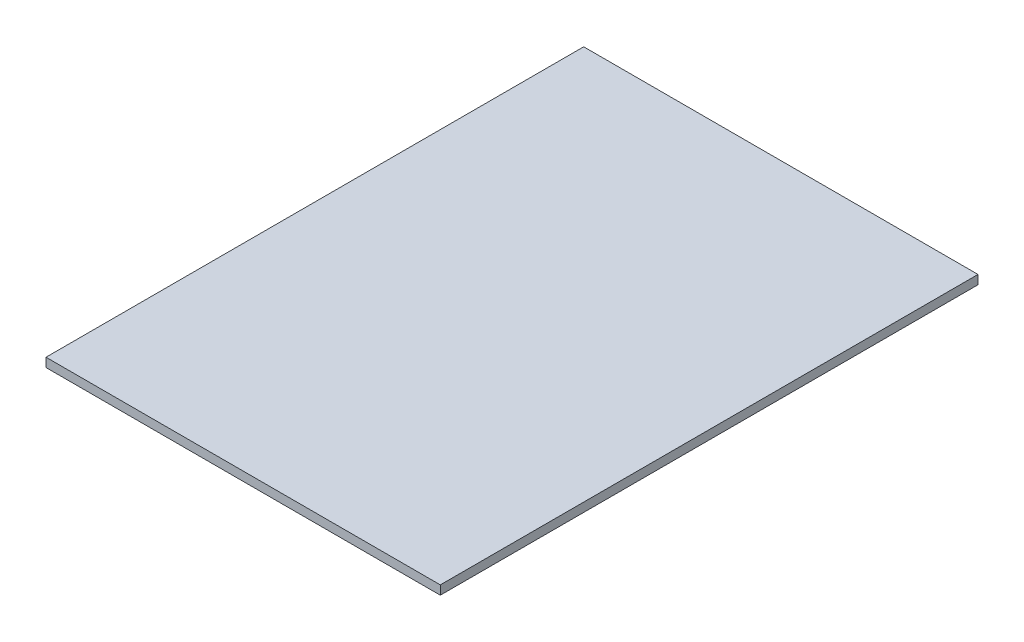
ISO-10303-21;
HEADER;
FILE_DESCRIPTION(('STEP AP214'),'2;1');
FILE_NAME('part.step','',(''),(''),'','','');
FILE_SCHEMA(('AUTOMOTIVE_DESIGN { 1 0 10303 214 1 1 1 1 }'));
ENDSEC;
DATA;
#1=APPLICATION_CONTEXT('core data for automotive mechanical design processes');
#2=APPLICATION_PROTOCOL_DEFINITION('international standard','automotive_design',2000,#1);
#3=PRODUCT_CONTEXT('',#1,'mechanical');
#4=PRODUCT('Part','Part','',(#3));
#5=PRODUCT_RELATED_PRODUCT_CATEGORY('part','',(#4));
#6=PRODUCT_DEFINITION_FORMATION('','',#4);
#7=PRODUCT_DEFINITION_CONTEXT('part definition',#1,'design');
#8=PRODUCT_DEFINITION('design','',#6,#7);
#9=PRODUCT_DEFINITION_SHAPE('','',#8);
#10=(LENGTH_UNIT() NAMED_UNIT(*) SI_UNIT(.MILLI.,.METRE.));
#11=(NAMED_UNIT(*) PLANE_ANGLE_UNIT() SI_UNIT($,.RADIAN.));
#12=(NAMED_UNIT(*) SI_UNIT($,.STERADIAN.) SOLID_ANGLE_UNIT());
#13=UNCERTAINTY_MEASURE_WITH_UNIT(LENGTH_MEASURE(1.E-05),#10,'distance_accuracy_value','');
#14=(GEOMETRIC_REPRESENTATION_CONTEXT(3) GLOBAL_UNCERTAINTY_ASSIGNED_CONTEXT((#13)) GLOBAL_UNIT_ASSIGNED_CONTEXT((#10,
#11,#12)) REPRESENTATION_CONTEXT('',''));
#15=CARTESIAN_POINT('',(0.,0.,0.));
#16=DIRECTION('',(0.,0.,1.));
#17=DIRECTION('',(1.,0.,0.));
#18=AXIS2_PLACEMENT_3D('',#15,#16,#17);
#19=CARTESIAN_POINT('',(-110.,5.,150.));
#20=DIRECTION('',(-1.,0.,0.));
#21=DIRECTION('',(0.,0.,1.));
#22=AXIS2_PLACEMENT_3D('',#19,#20,#21);
#23=PLANE('',#22);
#24=DIRECTION('',(0.,0.,-1.));
#25=VECTOR('',#24,1.);
#26=CARTESIAN_POINT('',(-110.,0.,150.));
#27=LINE('',#26,#25);
#28=CARTESIAN_POINT('',(-110.,0.,150.));
#29=VERTEX_POINT('',#28);
#30=CARTESIAN_POINT('',(-110.,0.,-150.));
#31=VERTEX_POINT('',#30);
#32=EDGE_CURVE('E116',#29,#31,#27,.T.);
#33=ORIENTED_EDGE('',*,*,#32,.F.);
#34=DIRECTION('',(0.,-1.,0.));
#35=VECTOR('',#34,1.);
#36=CARTESIAN_POINT('',(-110.,5.,150.));
#37=LINE('',#36,#35);
#38=CARTESIAN_POINT('',(-110.,5.,150.));
#39=VERTEX_POINT('',#38);
#40=EDGE_CURVE('E11',#39,#29,#37,.T.);
#41=ORIENTED_EDGE('',*,*,#40,.F.);
#42=DIRECTION('',(0.,0.,-1.));
#43=VECTOR('',#42,1.);
#44=CARTESIAN_POINT('',(-110.,5.,150.));
#45=LINE('',#44,#43);
#46=CARTESIAN_POINT('',(-110.,5.,-150.));
#47=VERTEX_POINT('',#46);
#48=EDGE_CURVE('E109',#39,#47,#45,.T.);
#49=ORIENTED_EDGE('',*,*,#48,.T.);
#50=DIRECTION('',(0.,-1.,0.));
#51=VECTOR('',#50,1.);
#52=CARTESIAN_POINT('',(-110.,5.,-150.));
#53=LINE('',#52,#51);
#54=EDGE_CURVE('E48',#47,#31,#53,.T.);
#55=ORIENTED_EDGE('',*,*,#54,.T.);
#56=EDGE_LOOP('',(#33,#41,#49,#55));
#57=FACE_BOUND('',#56,.T.);
#58=ADVANCED_FACE('F45',(#57),#23,.T.);
#59=CARTESIAN_POINT('',(-110.,5.,150.));
#60=DIRECTION('',(0.,0.,-1.));
#61=DIRECTION('',(-1.,0.,0.));
#62=AXIS2_PLACEMENT_3D('',#59,#60,#61);
#63=PLANE('',#62);
#64=DIRECTION('',(1.,0.,0.));
#65=VECTOR('',#64,1.);
#66=CARTESIAN_POINT('',(-110.,0.,150.));
#67=LINE('',#66,#65);
#68=CARTESIAN_POINT('',(110.,0.,150.));
#69=VERTEX_POINT('',#68);
#70=EDGE_CURVE('E79',#29,#69,#67,.T.);
#71=ORIENTED_EDGE('',*,*,#70,.T.);
#72=DIRECTION('',(0.,-1.,0.));
#73=VECTOR('',#72,1.);
#74=CARTESIAN_POINT('',(110.,5.,150.));
#75=LINE('',#74,#73);
#76=CARTESIAN_POINT('',(110.,5.,150.));
#77=VERTEX_POINT('',#76);
#78=EDGE_CURVE('E55',#77,#69,#75,.T.);
#79=ORIENTED_EDGE('',*,*,#78,.F.);
#80=DIRECTION('',(1.,0.,0.));
#81=VECTOR('',#80,1.);
#82=CARTESIAN_POINT('',(-110.,5.,150.));
#83=LINE('',#82,#81);
#84=EDGE_CURVE('E96',#39,#77,#83,.T.);
#85=ORIENTED_EDGE('',*,*,#84,.F.);
#86=ORIENTED_EDGE('',*,*,#40,.T.);
#87=EDGE_LOOP('',(#71,#79,#85,#86));
#88=FACE_BOUND('',#87,.T.);
#89=ADVANCED_FACE('F132',(#88),#63,.F.);
#90=CARTESIAN_POINT('',(110.,5.,150.));
#91=DIRECTION('',(-1.,0.,0.));
#92=DIRECTION('',(0.,0.,1.));
#93=AXIS2_PLACEMENT_3D('',#90,#91,#92);
#94=PLANE('',#93);
#95=DIRECTION('',(0.,0.,-1.));
#96=VECTOR('',#95,1.);
#97=CARTESIAN_POINT('',(110.,0.,150.));
#98=LINE('',#97,#96);
#99=CARTESIAN_POINT('',(110.,0.,-150.));
#100=VERTEX_POINT('',#99);
#101=EDGE_CURVE('E104',#69,#100,#98,.T.);
#102=ORIENTED_EDGE('',*,*,#101,.T.);
#103=DIRECTION('',(0.,-1.,0.));
#104=VECTOR('',#103,1.);
#105=CARTESIAN_POINT('',(110.,5.,-150.));
#106=LINE('',#105,#104);
#107=CARTESIAN_POINT('',(110.,5.,-150.));
#108=VERTEX_POINT('',#107);
#109=EDGE_CURVE('E101',#108,#100,#106,.T.);
#110=ORIENTED_EDGE('',*,*,#109,.F.);
#111=DIRECTION('',(0.,0.,-1.));
#112=VECTOR('',#111,1.);
#113=CARTESIAN_POINT('',(110.,5.,150.));
#114=LINE('',#113,#112);
#115=EDGE_CURVE('E91',#77,#108,#114,.T.);
#116=ORIENTED_EDGE('',*,*,#115,.F.);
#117=ORIENTED_EDGE('',*,*,#78,.T.);
#118=EDGE_LOOP('',(#102,#110,#116,#117));
#119=FACE_BOUND('',#118,.T.);
#120=ADVANCED_FACE('F102',(#119),#94,.F.);
#121=CARTESIAN_POINT('',(-110.,5.,-150.));
#122=DIRECTION('',(0.,0.,-1.));
#123=DIRECTION('',(-1.,0.,0.));
#124=AXIS2_PLACEMENT_3D('',#121,#122,#123);
#125=PLANE('',#124);
#126=DIRECTION('',(1.,0.,0.));
#127=VECTOR('',#126,1.);
#128=CARTESIAN_POINT('',(-110.,0.,-150.));
#129=LINE('',#128,#127);
#130=EDGE_CURVE('E120',#31,#100,#129,.T.);
#131=ORIENTED_EDGE('',*,*,#130,.F.);
#132=ORIENTED_EDGE('',*,*,#54,.F.);
#133=DIRECTION('',(1.,0.,0.));
#134=VECTOR('',#133,1.);
#135=CARTESIAN_POINT('',(-110.,5.,-150.));
#136=LINE('',#135,#134);
#137=EDGE_CURVE('E95',#47,#108,#136,.T.);
#138=ORIENTED_EDGE('',*,*,#137,.T.);
#139=ORIENTED_EDGE('',*,*,#109,.T.);
#140=EDGE_LOOP('',(#131,#132,#138,#139));
#141=FACE_BOUND('',#140,.T.);
#142=ADVANCED_FACE('F107',(#141),#125,.T.);
#143=CARTESIAN_POINT('',(0.,5.,0.));
#144=DIRECTION('',(0.,-1.,0.));
#145=DIRECTION('',(0.,0.,-1.));
#146=AXIS2_PLACEMENT_3D('',#143,#144,#145);
#147=PLANE('',#146);
#148=ORIENTED_EDGE('',*,*,#48,.F.);
#149=ORIENTED_EDGE('',*,*,#84,.T.);
#150=ORIENTED_EDGE('',*,*,#115,.T.);
#151=ORIENTED_EDGE('',*,*,#137,.F.);
#152=EDGE_LOOP('',(#148,#149,#150,#151));
#153=FACE_BOUND('',#152,.T.);
#154=ADVANCED_FACE('F94',(#153),#147,.F.);
#155=CARTESIAN_POINT('',(0.,0.,0.));
#156=DIRECTION('',(0.,-1.,0.));
#157=DIRECTION('',(0.,0.,-1.));
#158=AXIS2_PLACEMENT_3D('',#155,#156,#157);
#159=PLANE('',#158);
#160=ORIENTED_EDGE('',*,*,#32,.T.);
#161=ORIENTED_EDGE('',*,*,#130,.T.);
#162=ORIENTED_EDGE('',*,*,#101,.F.);
#163=ORIENTED_EDGE('',*,*,#70,.F.);
#164=EDGE_LOOP('',(#160,#161,#162,#163));
#165=FACE_BOUND('',#164,.T.);
#166=ADVANCED_FACE('F129',(#165),#159,.T.);
#167=CLOSED_SHELL('',(#58,#89,#120,#142,#154,#166));
#168=MANIFOLD_SOLID_BREP('B2',#167);
#169=ADVANCED_BREP_SHAPE_REPRESENTATION('',(#18,#168),#14);
#170=SHAPE_DEFINITION_REPRESENTATION(#9,#169);
ENDSEC;
END-ISO-10303-21;
